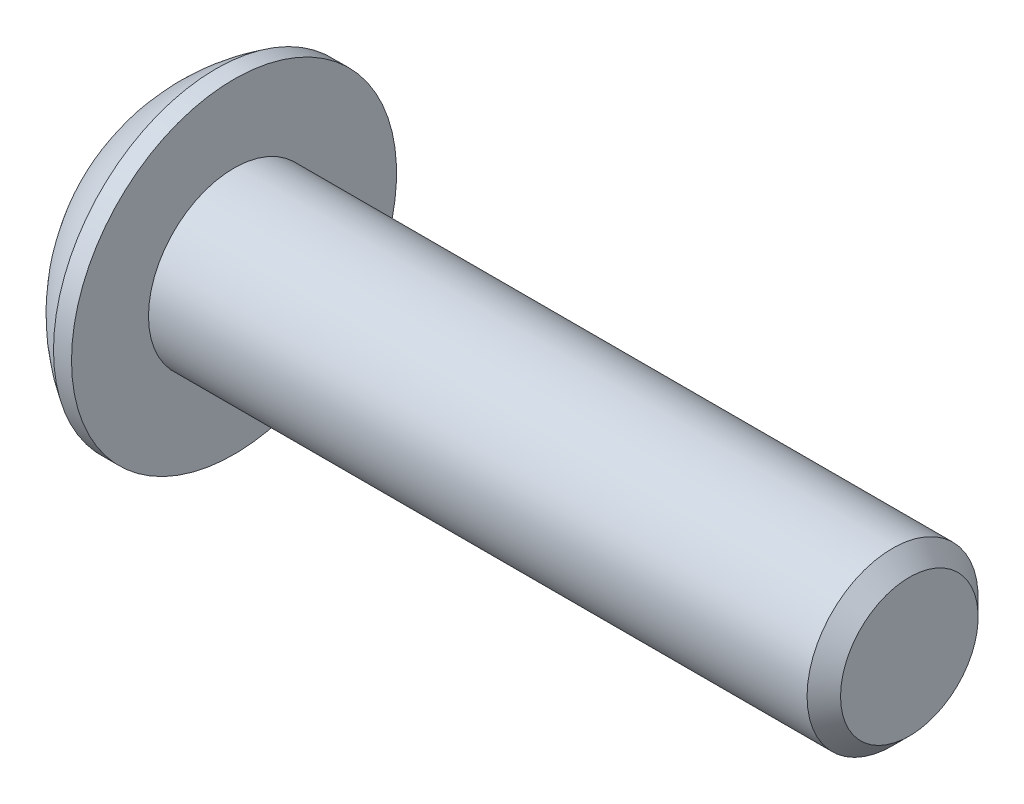
ISO-10303-21;
HEADER;
FILE_DESCRIPTION(('STEP AP214'),'2;1');
FILE_NAME('part.step','',(''),(''),'','','');
FILE_SCHEMA(('AUTOMOTIVE_DESIGN { 1 0 10303 214 1 1 1 1 }'));
ENDSEC;
DATA;
#1=APPLICATION_CONTEXT('core data for automotive mechanical design processes');
#2=APPLICATION_PROTOCOL_DEFINITION('international standard','automotive_design',2000,#1);
#3=PRODUCT_CONTEXT('',#1,'mechanical');
#4=PRODUCT('Part','Part','',(#3));
#5=PRODUCT_RELATED_PRODUCT_CATEGORY('part','',(#4));
#6=PRODUCT_DEFINITION_FORMATION('','',#4);
#7=PRODUCT_DEFINITION_CONTEXT('part definition',#1,'design');
#8=PRODUCT_DEFINITION('design','',#6,#7);
#9=PRODUCT_DEFINITION_SHAPE('','',#8);
#10=(LENGTH_UNIT() NAMED_UNIT(*) SI_UNIT(.MILLI.,.METRE.));
#11=(NAMED_UNIT(*) PLANE_ANGLE_UNIT() SI_UNIT($,.RADIAN.));
#12=(NAMED_UNIT(*) SI_UNIT($,.STERADIAN.) SOLID_ANGLE_UNIT());
#13=UNCERTAINTY_MEASURE_WITH_UNIT(LENGTH_MEASURE(1.E-05),#10,'distance_accuracy_value','');
#14=(GEOMETRIC_REPRESENTATION_CONTEXT(3) GLOBAL_UNCERTAINTY_ASSIGNED_CONTEXT((#13)) GLOBAL_UNIT_ASSIGNED_CONTEXT((#10,
#11,#12)) REPRESENTATION_CONTEXT('',''));
#15=CARTESIAN_POINT('',(0.,0.,0.));
#16=DIRECTION('',(0.,0.,1.));
#17=DIRECTION('',(1.,0.,0.));
#18=AXIS2_PLACEMENT_3D('',#15,#16,#17);
#19=CARTESIAN_POINT('',(0.,0.,0.));
#20=DIRECTION('',(-1.,0.,0.));
#21=DIRECTION('',(0.,0.,1.));
#22=AXIS2_PLACEMENT_3D('',#19,#20,#21);
#23=PLANE('',#22);
#24=CARTESIAN_POINT('',(0.,0.,0.));
#25=DIRECTION('',(-1.,0.,0.));
#26=DIRECTION('',(0.,0.,1.));
#27=AXIS2_PLACEMENT_3D('',#24,#25,#26);
#28=CIRCLE('',#27,2.29235);
#29=CARTESIAN_POINT('',(0.,2.29235,0.));
#30=VERTEX_POINT('',#29);
#31=EDGE_CURVE('E11',#30,#30,#28,.T.);
#32=ORIENTED_EDGE('',*,*,#31,.T.);
#33=EDGE_LOOP('',(#32));
#34=FACE_BOUND('',#33,.T.);
#35=DIRECTION('',(0.,-1.,0.));
#36=VECTOR('',#35,1.);
#37=CARTESIAN_POINT('',(0.,-0.91654355233853,1.5875));
#38=LINE('',#37,#36);
#39=CARTESIAN_POINT('',(0.,0.916543552338533,1.5875));
#40=VERTEX_POINT('',#39);
#41=CARTESIAN_POINT('',(0.,-0.91654355233853,1.5875));
#42=VERTEX_POINT('',#41);
#43=EDGE_CURVE('E47',#40,#42,#38,.T.);
#44=ORIENTED_EDGE('',*,*,#43,.T.);
#45=DIRECTION('',(0.,-0.5,-0.866025403784439));
#46=VECTOR('',#45,1.);
#47=CARTESIAN_POINT('',(0.,-1.83308710467706,0.));
#48=LINE('',#47,#46);
#49=CARTESIAN_POINT('',(0.,-1.83308710467706,0.));
#50=VERTEX_POINT('',#49);
#51=EDGE_CURVE('E363',#42,#50,#48,.T.);
#52=ORIENTED_EDGE('',*,*,#51,.T.);
#53=DIRECTION('',(0.,0.499999999999999,-0.866025403784439));
#54=VECTOR('',#53,1.);
#55=CARTESIAN_POINT('',(0.,-0.91654355233853,-1.5875));
#56=LINE('',#55,#54);
#57=CARTESIAN_POINT('',(0.,-0.91654355233853,-1.5875));
#58=VERTEX_POINT('',#57);
#59=EDGE_CURVE('E127',#50,#58,#56,.T.);
#60=ORIENTED_EDGE('',*,*,#59,.T.);
#61=DIRECTION('',(0.,1.,0.));
#62=VECTOR('',#61,1.);
#63=CARTESIAN_POINT('',(0.,0.916543552338533,-1.5875));
#64=LINE('',#63,#62);
#65=CARTESIAN_POINT('',(0.,0.916543552338533,-1.5875));
#66=VERTEX_POINT('',#65);
#67=EDGE_CURVE('E366',#58,#66,#64,.T.);
#68=ORIENTED_EDGE('',*,*,#67,.T.);
#69=DIRECTION('',(0.,0.5,0.866025403784439));
#70=VECTOR('',#69,1.);
#71=CARTESIAN_POINT('',(0.,1.83308710467706,0.));
#72=LINE('',#71,#70);
#73=CARTESIAN_POINT('',(0.,1.83308710467706,0.));
#74=VERTEX_POINT('',#73);
#75=EDGE_CURVE('E368',#66,#74,#72,.T.);
#76=ORIENTED_EDGE('',*,*,#75,.T.);
#77=DIRECTION('',(0.,-0.5,0.866025403784439));
#78=VECTOR('',#77,1.);
#79=CARTESIAN_POINT('',(0.,0.916543552338533,1.5875));
#80=LINE('',#79,#78);
#81=EDGE_CURVE('E370',#74,#40,#80,.T.);
#82=ORIENTED_EDGE('',*,*,#81,.T.);
#83=EDGE_LOOP('',(#44,#52,#60,#68,#76,#82));
#84=FACE_BOUND('',#83,.T.);
#85=ADVANCED_FACE('F33',(#34,#84),#23,.T.);
#86=CARTESIAN_POINT('',(4.85989606481482,0.,0.));
#87=DIRECTION('',(-1.,0.,0.));
#88=DIRECTION('',(0.,1.,0.));
#89=AXIS2_PLACEMENT_3D('',#86,#87,#88);
#90=SPHERICAL_SURFACE('',#89,5.37340285883187);
#91=CARTESIAN_POINT('',(2.0574,0.,0.));
#92=DIRECTION('',(-1.,0.,0.));
#93=DIRECTION('',(0.,0.,1.));
#94=AXIS2_PLACEMENT_3D('',#91,#92,#93);
#95=CIRCLE('',#94,4.5847);
#96=CARTESIAN_POINT('',(2.0574,4.5847,0.));
#97=VERTEX_POINT('',#96);
#98=EDGE_CURVE('E40',#97,#97,#95,.T.);
#99=CARTESIAN_POINT('',(2.0574,4.5847,0.));
#100=CARTESIAN_POINT('',(2.02963444466226,4.56772775071364,0.));
#101=CARTESIAN_POINT('',(2.00202310563314,4.55050321576171,0.));
#102=CARTESIAN_POINT('',(1.94711789153313,4.51555538986232,0.));
#103=CARTESIAN_POINT('',(1.91982401646224,4.49783209891487,0.));
#104=CARTESIAN_POINT('',(1.8655627616196,4.46189257636009,0.));
#105=CARTESIAN_POINT('',(1.83859538184787,4.44367634475277,0.));
#106=CARTESIAN_POINT('',(1.78499601309644,4.40675696303686,0.));
#107=CARTESIAN_POINT('',(1.75836402411674,4.38805381292827,0.));
#108=CARTESIAN_POINT('',(1.70544422925954,4.35016676527117,0.));
#109=CARTESIAN_POINT('',(1.67915642338203,4.33098286772266,0.));
#110=CARTESIAN_POINT('',(1.62693367141508,4.29214065809995,0.));
#111=CARTESIAN_POINT('',(1.60099872532564,4.27248234602574,0.));
#112=CARTESIAN_POINT('',(1.54949025368841,4.23269779601254,0.));
#113=CARTESIAN_POINT('',(1.52391672814064,4.21257155807355,0.));
#114=CARTESIAN_POINT('',(1.4731395388975,4.17185779967265,0.));
#115=CARTESIAN_POINT('',(1.44793587520214,4.15127027921074,0.));
#116=CARTESIAN_POINT('',(1.39790672892889,4.10964075130566,0.));
#117=CARTESIAN_POINT('',(1.37308124635099,4.08859874386249,0.));
#118=CARTESIAN_POINT('',(1.32381665673685,4.04606718757047,0.));
#119=CARTESIAN_POINT('',(1.29937754970059,4.02457763872164,0.));
#120=CARTESIAN_POINT('',(1.25089377806135,3.98115809291456,0.));
#121=CARTESIAN_POINT('',(1.22684911345837,3.95922809595632,0.));
#122=CARTESIAN_POINT('',(1.1791621633785,3.91493489261154,0.));
#123=CARTESIAN_POINT('',(1.15551987790161,3.89257168622499,0.));
#124=CARTESIAN_POINT('',(1.10864548994917,3.84741944569868,0.));
#125=CARTESIAN_POINT('',(1.08541338747362,3.82463041155892,0.));
#126=CARTESIAN_POINT('',(1.03936703400529,3.77863403775912,0.));
#127=CARTESIAN_POINT('',(1.01655278301252,3.75542669809907,0.));
#128=CARTESIAN_POINT('',(0.97134966306629,3.70860137356642,0.));
#129=CARTESIAN_POINT('',(0.948960794112831,3.68498338869381,0.));
#130=CARTESIAN_POINT('',(0.904615828391114,3.63734456959005,0.));
#131=CARTESIAN_POINT('',(0.882659731622856,3.61332373535889,0.));
#132=CARTESIAN_POINT('',(0.839187557567447,3.56488714636505,0.));
#133=CARTESIAN_POINT('',(0.817671480280296,3.54047139160237,0.));
#134=CARTESIAN_POINT('',(0.775086447240823,3.4912530207284,0.));
#135=CARTESIAN_POINT('',(0.754017491488502,3.46645040461709,0.));
#136=CARTESIAN_POINT('',(0.712333655985979,3.41646649792444,0.));
#137=CARTESIAN_POINT('',(0.691718776235777,3.39128520734308,0.));
#138=CARTESIAN_POINT('',(0.650949897322802,3.34055226358224,0.));
#139=CARTESIAN_POINT('',(0.630795898160028,3.31500061040275,0.));
#140=CARTESIAN_POINT('',(0.590955432879198,3.2635353755673,0.));
#141=CARTESIAN_POINT('',(0.571268966761141,3.23762179391134,0.));
#142=CARTESIAN_POINT('',(0.532370065703055,3.18544125571044,0.));
#143=CARTESIAN_POINT('',(0.513157630763025,3.1591742991655,0.));
#144=CARTESIAN_POINT('',(0.47521313372583,3.10629568141642,0.));
#145=CARTESIAN_POINT('',(0.456481071628664,3.07968402021228,0.));
#146=CARTESIAN_POINT('',(0.41950350337872,3.02612477715572,0.));
#147=CARTESIAN_POINT('',(0.401257997225941,2.9991771953033,0.));
#148=CARTESIAN_POINT('',(0.365259563367946,2.94495500583993,0.));
#149=CARTESIAN_POINT('',(0.34750663566273,2.91768039822897,0.));
#150=CARTESIAN_POINT('',(0.312499218594778,2.86281316009189,0.));
#151=CARTESIAN_POINT('',(0.295244729232042,2.83522052956578,0.));
#152=CARTESIAN_POINT('',(0.261239884283562,2.77972635338318,0.));
#153=CARTESIAN_POINT('',(0.24448952869782,2.7518248077267,0.));
#154=CARTESIAN_POINT('',(0.21149848009108,2.69572201115466,0.));
#155=CARTESIAN_POINT('',(0.195257787070082,2.66752076023909,0.));
#156=CARTESIAN_POINT('',(0.163291425052402,2.61082786150165,0.));
#157=CARTESIAN_POINT('',(0.147565756055719,2.58233621367977,0.));
#158=CARTESIAN_POINT('',(0.116634630180611,2.52507192700006,0.));
#159=CARTESIAN_POINT('',(0.101429173302187,2.49629928814223,0.));
#160=CARTESIAN_POINT('',(0.071543500606801,2.43848251180434,0.));
#161=CARTESIAN_POINT('',(0.0568632847898391,2.40943837432427,0.));
#162=CARTESIAN_POINT('',(0.0280329029081006,2.35108820593535,0.));
#163=CARTESIAN_POINT('',(0.013882736843324,2.3217821750265,0.));
#164=CARTESIAN_POINT('',(0.,2.29235,0.));
#165=B_SPLINE_CURVE_WITH_KNOTS('',3,(#99,#100,#101,#102,#103,#104,#105,#106,#107,#108,#109,#110,
#111,#112,#113,#114,#115,#116,#117,#118,#119,#120,#121,#122,#123,#124,#125,#126,#127,#128,#129,
#130,#131,#132,#133,#134,#135,#136,#137,#138,#139,#140,#141,#142,#143,#144,#145,#146,#147,#148,
#149,#150,#151,#152,#153,#154,#155,#156,#157,#158,#159,#160,#161,#162,#163,#164),.UNSPECIFIED.,
.F.,.F.,(4,2,2,2,2,2,2,2,2,2,2,2,2,2,2,2,2,2,2,2,2,2,2,2,2,2,2,2,2,2,2,2,4),(0.,
0.0976247266467792,0.195249453293559,0.292874179940338,0.390498906587117,0.488123633233896,
0.585748359880676,0.683373086527455,0.780997813174234,0.878622539821013,0.976247266467793,
1.07387199311457,1.17149671976135,1.26912144640813,1.36674617305491,1.46437089970169,
1.56199562634847,1.65962035299525,1.75724507964203,1.85486980628881,1.95249453293559,
2.05011925958236,2.14774398622914,2.24536871287592,2.3429934395227,2.44061816616948,
2.53824289281626,2.63586761946304,2.73349234610982,2.8311170727566,2.92874179940338,
3.02636652605016,3.12399125269694),.UNSPECIFIED.);
#166=EDGE_CURVE('BSEAM154',#97,#30,#165,.T.);
#167=ORIENTED_EDGE('',*,*,#98,.T.);
#168=ORIENTED_EDGE('',*,*,#31,.F.);
#169=ORIENTED_EDGE('',*,*,#166,.T.);
#170=ORIENTED_EDGE('',*,*,#166,.F.);
#171=EDGE_LOOP('',(#167,#169,#168,#170));
#172=FACE_BOUND('',#171,.T.);
#173=ADVANCED_FACE('F154',(#172),#90,.T.);
#174=CARTESIAN_POINT('',(0.,0.,0.));
#175=DIRECTION('',(-1.,0.,0.));
#176=DIRECTION('',(0.,0.,1.));
#177=AXIS2_PLACEMENT_3D('',#174,#175,#176);
#178=CYLINDRICAL_SURFACE('',#177,4.5847);
#179=ORIENTED_EDGE('',*,*,#98,.F.);
#180=EDGE_LOOP('',(#179));
#181=FACE_BOUND('',#180,.T.);
#182=CARTESIAN_POINT('',(2.5654,0.,0.));
#183=DIRECTION('',(-1.,0.,0.));
#184=DIRECTION('',(0.,0.,1.));
#185=AXIS2_PLACEMENT_3D('',#182,#183,#184);
#186=CIRCLE('',#185,4.5847);
#187=CARTESIAN_POINT('',(2.5654,0.,4.5847));
#188=VERTEX_POINT('',#187);
#189=EDGE_CURVE('E149',#188,#188,#186,.T.);
#190=ORIENTED_EDGE('',*,*,#189,.T.);
#191=EDGE_LOOP('',(#190));
#192=FACE_BOUND('',#191,.T.);
#193=ADVANCED_FACE('F157',(#181,#192),#178,.T.);
#194=CARTESIAN_POINT('',(2.5654,2.41299999999999,0.));
#195=DIRECTION('',(-1.,0.,0.));
#196=DIRECTION('',(0.,0.,1.));
#197=AXIS2_PLACEMENT_3D('',#194,#195,#196);
#198=PLANE('',#197);
#199=ORIENTED_EDGE('',*,*,#189,.F.);
#200=EDGE_LOOP('',(#199));
#201=FACE_BOUND('',#200,.T.);
#202=CARTESIAN_POINT('',(2.5654,0.,0.));
#203=DIRECTION('',(-1.,0.,0.));
#204=DIRECTION('',(0.,0.,1.));
#205=AXIS2_PLACEMENT_3D('',#202,#203,#204);
#206=CIRCLE('',#205,2.41299999999999);
#207=CARTESIAN_POINT('',(2.5654,0.,2.41299999999999));
#208=VERTEX_POINT('',#207);
#209=EDGE_CURVE('E146',#208,#208,#206,.T.);
#210=ORIENTED_EDGE('',*,*,#209,.T.);
#211=EDGE_LOOP('',(#210));
#212=FACE_BOUND('',#211,.T.);
#213=ADVANCED_FACE('F160',(#201,#212),#198,.F.);
#214=CARTESIAN_POINT('',(0.,0.,0.));
#215=DIRECTION('',(-1.,0.,0.));
#216=DIRECTION('',(0.,0.,1.));
#217=AXIS2_PLACEMENT_3D('',#214,#215,#216);
#218=CYLINDRICAL_SURFACE('',#217,2.413);
#219=ORIENTED_EDGE('',*,*,#209,.F.);
#220=EDGE_LOOP('',(#219));
#221=FACE_BOUND('',#220,.T.);
#222=CARTESIAN_POINT('',(21.14296,0.,0.));
#223=DIRECTION('',(-1.,0.,0.));
#224=DIRECTION('',(0.,0.,1.));
#225=AXIS2_PLACEMENT_3D('',#222,#223,#224);
#226=CIRCLE('',#225,2.413);
#227=CARTESIAN_POINT('',(21.14296,0.,2.413));
#228=VERTEX_POINT('',#227);
#229=EDGE_CURVE('E143',#228,#228,#226,.T.);
#230=ORIENTED_EDGE('',*,*,#229,.T.);
#231=EDGE_LOOP('',(#230));
#232=FACE_BOUND('',#231,.T.);
#233=ADVANCED_FACE('F166',(#221,#232),#218,.T.);
#234=CARTESIAN_POINT('',(21.6154,0.,0.));
#235=DIRECTION('',(-1.,0.,0.));
#236=DIRECTION('',(0.,0.,1.));
#237=AXIS2_PLACEMENT_3D('',#234,#235,#236);
#238=CONICAL_SURFACE('',#237,1.94056,0.785398163397437);
#239=ORIENTED_EDGE('',*,*,#229,.F.);
#240=EDGE_LOOP('',(#239));
#241=FACE_BOUND('',#240,.T.);
#242=CARTESIAN_POINT('',(21.6154,0.,0.));
#243=DIRECTION('',(-1.,0.,0.));
#244=DIRECTION('',(0.,0.,1.));
#245=AXIS2_PLACEMENT_3D('',#242,#243,#244);
#246=CIRCLE('',#245,1.94056);
#247=CARTESIAN_POINT('',(21.6154,0.,1.94056));
#248=VERTEX_POINT('',#247);
#249=EDGE_CURVE('E139',#248,#248,#246,.T.);
#250=ORIENTED_EDGE('',*,*,#249,.T.);
#251=EDGE_LOOP('',(#250));
#252=FACE_BOUND('',#251,.T.);
#253=ADVANCED_FACE('F172',(#241,#252),#238,.T.);
#254=CARTESIAN_POINT('',(21.6154,0.,0.));
#255=DIRECTION('',(-1.,0.,0.));
#256=DIRECTION('',(0.,0.,1.));
#257=AXIS2_PLACEMENT_3D('',#254,#255,#256);
#258=PLANE('',#257);
#259=ORIENTED_EDGE('',*,*,#249,.F.);
#260=EDGE_LOOP('',(#259));
#261=FACE_BOUND('',#260,.T.);
#262=ADVANCED_FACE('F178',(#261),#258,.F.);
#263=CARTESIAN_POINT('',(1.778,-1.83308710467706,0.));
#264=DIRECTION('',(0.,0.866025403784439,-0.5));
#265=DIRECTION('',(0.,0.5,0.866025403784439));
#266=AXIS2_PLACEMENT_3D('',#263,#264,#265);
#267=PLANE('',#266);
#268=DIRECTION('',(0.,-0.5,-0.866025403784439));
#269=VECTOR('',#268,1.);
#270=CARTESIAN_POINT('',(1.778,-1.83308710467706,0.));
#271=LINE('',#270,#269);
#272=CARTESIAN_POINT('',(1.778,-0.91654355233853,1.5875));
#273=VERTEX_POINT('',#272);
#274=CARTESIAN_POINT('',(1.778,-1.3748153285078,0.793749999999999));
#275=VERTEX_POINT('',#274);
#276=EDGE_CURVE('E113',#273,#275,#271,.T.);
#277=ORIENTED_EDGE('',*,*,#276,.T.);
#278=CARTESIAN_POINT('',(1.778,-1.83308710467706,0.));
#279=VERTEX_POINT('',#278);
#280=EDGE_CURVE('E108',#275,#279,#271,.T.);
#281=ORIENTED_EDGE('',*,*,#280,.T.);
#282=DIRECTION('',(-1.,0.,0.));
#283=VECTOR('',#282,1.);
#284=CARTESIAN_POINT('',(1.778,-1.83308710467706,0.));
#285=LINE('',#284,#283);
#286=EDGE_CURVE('E110',#279,#50,#285,.T.);
#287=ORIENTED_EDGE('',*,*,#286,.T.);
#288=ORIENTED_EDGE('',*,*,#51,.F.);
#289=DIRECTION('',(-1.,0.,0.));
#290=VECTOR('',#289,1.);
#291=CARTESIAN_POINT('',(1.778,-0.91654355233853,1.5875));
#292=LINE('',#291,#290);
#293=EDGE_CURVE('E358',#273,#42,#292,.T.);
#294=ORIENTED_EDGE('',*,*,#293,.F.);
#295=EDGE_LOOP('',(#277,#281,#287,#288,#294));
#296=FACE_BOUND('',#295,.T.);
#297=ADVANCED_FACE('F109',(#296),#267,.T.);
#298=CARTESIAN_POINT('',(1.778,-0.91654355233853,-1.5875));
#299=DIRECTION('',(0.,0.866025403784439,0.499999999999999));
#300=DIRECTION('',(0.,-0.499999999999999,0.866025403784439));
#301=AXIS2_PLACEMENT_3D('',#298,#299,#300);
#302=PLANE('',#301);
#303=DIRECTION('',(0.,0.499999999999999,-0.866025403784439));
#304=VECTOR('',#303,1.);
#305=CARTESIAN_POINT('',(1.778,-0.91654355233853,-1.5875));
#306=LINE('',#305,#304);
#307=CARTESIAN_POINT('',(1.778,-1.3748153285078,-0.793749999999999));
#308=VERTEX_POINT('',#307);
#309=EDGE_CURVE('E55',#279,#308,#306,.T.);
#310=ORIENTED_EDGE('',*,*,#309,.T.);
#311=CARTESIAN_POINT('',(1.778,-0.91654355233853,-1.5875));
#312=VERTEX_POINT('',#311);
#313=EDGE_CURVE('E122',#308,#312,#306,.T.);
#314=ORIENTED_EDGE('',*,*,#313,.T.);
#315=DIRECTION('',(-1.,0.,0.));
#316=VECTOR('',#315,1.);
#317=CARTESIAN_POINT('',(1.778,-0.91654355233853,-1.5875));
#318=LINE('',#317,#316);
#319=EDGE_CURVE('E129',#312,#58,#318,.T.);
#320=ORIENTED_EDGE('',*,*,#319,.T.);
#321=ORIENTED_EDGE('',*,*,#59,.F.);
#322=ORIENTED_EDGE('',*,*,#286,.F.);
#323=EDGE_LOOP('',(#310,#314,#320,#321,#322));
#324=FACE_BOUND('',#323,.T.);
#325=ADVANCED_FACE('F125',(#324),#302,.T.);
#326=CARTESIAN_POINT('',(1.778,0.916543552338533,-1.5875));
#327=DIRECTION('',(0.,0.,1.));
#328=DIRECTION('',(0.,-1.,0.));
#329=AXIS2_PLACEMENT_3D('',#326,#327,#328);
#330=PLANE('',#329);
#331=DIRECTION('',(0.,1.,0.));
#332=VECTOR('',#331,1.);
#333=CARTESIAN_POINT('',(1.778,0.916543552338533,-1.5875));
#334=LINE('',#333,#332);
#335=CARTESIAN_POINT('',(1.778,0.,-1.5875));
#336=VERTEX_POINT('',#335);
#337=EDGE_CURVE('E388',#312,#336,#334,.T.);
#338=ORIENTED_EDGE('',*,*,#337,.T.);
#339=CARTESIAN_POINT('',(1.778,0.916543552338533,-1.5875));
#340=VERTEX_POINT('',#339);
#341=EDGE_CURVE('E121',#336,#340,#334,.T.);
#342=ORIENTED_EDGE('',*,*,#341,.T.);
#343=DIRECTION('',(-1.,0.,0.));
#344=VECTOR('',#343,1.);
#345=CARTESIAN_POINT('',(1.778,0.916543552338533,-1.5875));
#346=LINE('',#345,#344);
#347=EDGE_CURVE('E134',#340,#66,#346,.T.);
#348=ORIENTED_EDGE('',*,*,#347,.T.);
#349=ORIENTED_EDGE('',*,*,#67,.F.);
#350=ORIENTED_EDGE('',*,*,#319,.F.);
#351=EDGE_LOOP('',(#338,#342,#348,#349,#350));
#352=FACE_BOUND('',#351,.T.);
#353=ADVANCED_FACE('F237',(#352),#330,.T.);
#354=CARTESIAN_POINT('',(1.778,1.83308710467706,0.));
#355=DIRECTION('',(0.,-0.866025403784439,0.5));
#356=DIRECTION('',(0.,-0.5,-0.866025403784439));
#357=AXIS2_PLACEMENT_3D('',#354,#355,#356);
#358=PLANE('',#357);
#359=DIRECTION('',(0.,0.5,0.866025403784439));
#360=VECTOR('',#359,1.);
#361=CARTESIAN_POINT('',(1.778,1.83308710467706,0.));
#362=LINE('',#361,#360);
#363=CARTESIAN_POINT('',(1.778,1.3748153285078,-0.793750000000001));
#364=VERTEX_POINT('',#363);
#365=EDGE_CURVE('E392',#340,#364,#362,.T.);
#366=ORIENTED_EDGE('',*,*,#365,.T.);
#367=CARTESIAN_POINT('',(1.778,1.83308710467706,0.));
#368=VERTEX_POINT('',#367);
#369=EDGE_CURVE('E390',#364,#368,#362,.T.);
#370=ORIENTED_EDGE('',*,*,#369,.T.);
#371=DIRECTION('',(-1.,0.,0.));
#372=VECTOR('',#371,1.);
#373=CARTESIAN_POINT('',(1.778,1.83308710467706,0.));
#374=LINE('',#373,#372);
#375=EDGE_CURVE('E374',#368,#74,#374,.T.);
#376=ORIENTED_EDGE('',*,*,#375,.T.);
#377=ORIENTED_EDGE('',*,*,#75,.F.);
#378=ORIENTED_EDGE('',*,*,#347,.F.);
#379=EDGE_LOOP('',(#366,#370,#376,#377,#378));
#380=FACE_BOUND('',#379,.T.);
#381=ADVANCED_FACE('F246',(#380),#358,.T.);
#382=CARTESIAN_POINT('',(1.778,0.916543552338533,1.5875));
#383=DIRECTION('',(0.,-0.866025403784439,-0.5));
#384=DIRECTION('',(0.,0.5,-0.866025403784439));
#385=AXIS2_PLACEMENT_3D('',#382,#383,#384);
#386=PLANE('',#385);
#387=DIRECTION('',(0.,-0.5,0.866025403784439));
#388=VECTOR('',#387,1.);
#389=CARTESIAN_POINT('',(1.778,0.916543552338533,1.5875));
#390=LINE('',#389,#388);
#391=CARTESIAN_POINT('',(1.778,1.3748153285078,0.793750000000001));
#392=VERTEX_POINT('',#391);
#393=EDGE_CURVE('E353',#368,#392,#390,.T.);
#394=ORIENTED_EDGE('',*,*,#393,.T.);
#395=CARTESIAN_POINT('',(1.778,0.916543552338533,1.5875));
#396=VERTEX_POINT('',#395);
#397=EDGE_CURVE('E349',#392,#396,#390,.T.);
#398=ORIENTED_EDGE('',*,*,#397,.T.);
#399=DIRECTION('',(-1.,0.,0.));
#400=VECTOR('',#399,1.);
#401=CARTESIAN_POINT('',(1.778,0.916543552338533,1.5875));
#402=LINE('',#401,#400);
#403=EDGE_CURVE('E357',#396,#40,#402,.T.);
#404=ORIENTED_EDGE('',*,*,#403,.T.);
#405=ORIENTED_EDGE('',*,*,#81,.F.);
#406=ORIENTED_EDGE('',*,*,#375,.F.);
#407=EDGE_LOOP('',(#394,#398,#404,#405,#406));
#408=FACE_BOUND('',#407,.T.);
#409=ADVANCED_FACE('F256',(#408),#386,.T.);
#410=CARTESIAN_POINT('',(1.778,-0.91654355233853,1.5875));
#411=DIRECTION('',(0.,0.,-1.));
#412=DIRECTION('',(0.,1.,0.));
#413=AXIS2_PLACEMENT_3D('',#410,#411,#412);
#414=PLANE('',#413);
#415=DIRECTION('',(0.,-1.,0.));
#416=VECTOR('',#415,1.);
#417=CARTESIAN_POINT('',(1.778,-0.91654355233853,1.5875));
#418=LINE('',#417,#416);
#419=CARTESIAN_POINT('',(1.778,0.,1.5875));
#420=VERTEX_POINT('',#419);
#421=EDGE_CURVE('E348',#396,#420,#418,.T.);
#422=ORIENTED_EDGE('',*,*,#421,.T.);
#423=EDGE_CURVE('E351',#420,#273,#418,.T.);
#424=ORIENTED_EDGE('',*,*,#423,.T.);
#425=ORIENTED_EDGE('',*,*,#293,.T.);
#426=ORIENTED_EDGE('',*,*,#43,.F.);
#427=ORIENTED_EDGE('',*,*,#403,.F.);
#428=EDGE_LOOP('',(#422,#424,#425,#426,#427));
#429=FACE_BOUND('',#428,.T.);
#430=ADVANCED_FACE('F266',(#429),#414,.T.);
#431=CARTESIAN_POINT('',(1.778,-2.74963065701559,-1.5875));
#432=DIRECTION('',(1.,0.,0.));
#433=DIRECTION('',(0.,0.,-1.));
#434=AXIS2_PLACEMENT_3D('',#431,#432,#433);
#435=PLANE('',#434);
#436=CARTESIAN_POINT('',(1.778,0.,0.));
#437=DIRECTION('',(-1.,0.,0.));
#438=DIRECTION('',(0.,0.,1.));
#439=AXIS2_PLACEMENT_3D('',#436,#437,#438);
#440=CIRCLE('',#439,1.5875);
#441=EDGE_CURVE('E395',#364,#336,#440,.T.);
#442=ORIENTED_EDGE('',*,*,#441,.F.);
#443=ORIENTED_EDGE('',*,*,#365,.F.);
#444=ORIENTED_EDGE('',*,*,#341,.F.);
#445=EDGE_LOOP('',(#442,#443,#444));
#446=FACE_BOUND('',#445,.T.);
#447=ADVANCED_FACE('F276',(#446),#435,.F.);
#448=EDGE_CURVE('E140',#392,#364,#440,.T.);
#449=ORIENTED_EDGE('',*,*,#448,.F.);
#450=ORIENTED_EDGE('',*,*,#393,.F.);
#451=ORIENTED_EDGE('',*,*,#369,.F.);
#452=EDGE_LOOP('',(#449,#450,#451));
#453=FACE_BOUND('',#452,.T.);
#454=ADVANCED_FACE('F286',(#453),#435,.F.);
#455=EDGE_CURVE('E133',#420,#392,#440,.T.);
#456=ORIENTED_EDGE('',*,*,#455,.F.);
#457=ORIENTED_EDGE('',*,*,#421,.F.);
#458=ORIENTED_EDGE('',*,*,#397,.F.);
#459=EDGE_LOOP('',(#456,#457,#458));
#460=FACE_BOUND('',#459,.T.);
#461=ADVANCED_FACE('F297',(#460),#435,.F.);
#462=EDGE_CURVE('E128',#275,#420,#440,.T.);
#463=ORIENTED_EDGE('',*,*,#462,.F.);
#464=ORIENTED_EDGE('',*,*,#276,.F.);
#465=ORIENTED_EDGE('',*,*,#423,.F.);
#466=EDGE_LOOP('',(#463,#464,#465));
#467=FACE_BOUND('',#466,.T.);
#468=ADVANCED_FACE('F306',(#467),#435,.F.);
#469=EDGE_CURVE('E119',#308,#275,#440,.T.);
#470=ORIENTED_EDGE('',*,*,#469,.F.);
#471=ORIENTED_EDGE('',*,*,#309,.F.);
#472=ORIENTED_EDGE('',*,*,#280,.F.);
#473=EDGE_LOOP('',(#470,#471,#472));
#474=FACE_BOUND('',#473,.T.);
#475=ADVANCED_FACE('F118',(#474),#435,.F.);
#476=EDGE_CURVE('E389',#336,#308,#440,.T.);
#477=ORIENTED_EDGE('',*,*,#476,.F.);
#478=ORIENTED_EDGE('',*,*,#337,.F.);
#479=ORIENTED_EDGE('',*,*,#313,.F.);
#480=EDGE_LOOP('',(#477,#478,#479));
#481=FACE_BOUND('',#480,.T.);
#482=ADVANCED_FACE('F289',(#481),#435,.F.);
#483=CARTESIAN_POINT('',(2.69454355233854,0.,0.));
#484=DIRECTION('',(-1.,0.,0.));
#485=DIRECTION('',(0.,0.,1.));
#486=AXIS2_PLACEMENT_3D('',#483,#484,#485);
#487=CONICAL_SURFACE('',#486,0.,1.04719755119659);
#488=ORIENTED_EDGE('',*,*,#455,.T.);
#489=ORIENTED_EDGE('',*,*,#448,.T.);
#490=ORIENTED_EDGE('',*,*,#441,.T.);
#491=ORIENTED_EDGE('',*,*,#476,.T.);
#492=ORIENTED_EDGE('',*,*,#469,.T.);
#493=ORIENTED_EDGE('',*,*,#462,.T.);
#494=EDGE_LOOP('',(#488,#489,#490,#491,#492,#493));
#495=FACE_BOUND('',#494,.T.);
#496=CARTESIAN_POINT('',(2.69454355233854,0.,0.));
#497=VERTEX_POINT('',#496);
#498=VERTEX_LOOP('',#497);
#499=FACE_BOUND('',#498,.T.);
#500=ADVANCED_FACE('F330',(#495,#499),#487,.F.);
#501=CLOSED_SHELL('',(#85,#173,#193,#213,#233,#253,#262,#297,#325,#353,#381,#409,#430,#447,#454,
#461,#468,#475,#482,#500));
#502=MANIFOLD_SOLID_BREP('B2',#501);
#503=ADVANCED_BREP_SHAPE_REPRESENTATION('',(#18,#502),#14);
#504=SHAPE_DEFINITION_REPRESENTATION(#9,#503);
ENDSEC;
END-ISO-10303-21;
